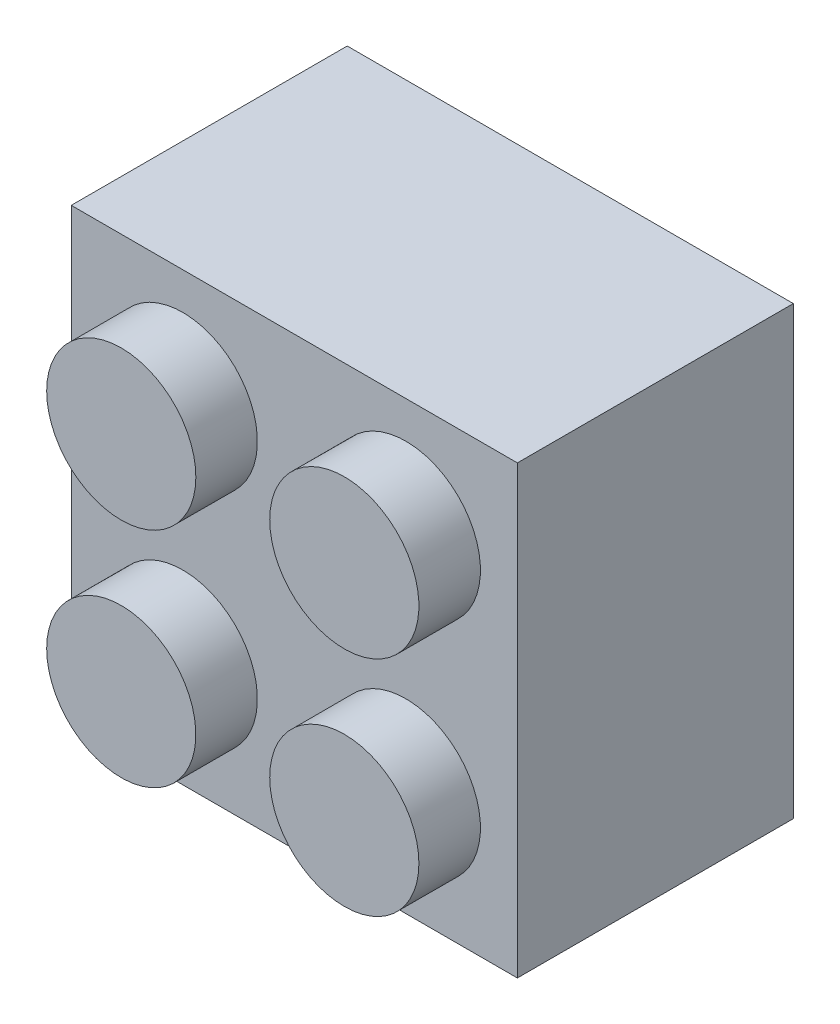
ISO-10303-21;
HEADER;
FILE_DESCRIPTION(('STEP AP214'),'2;1');
FILE_NAME('part.step','',(''),(''),'','','');
FILE_SCHEMA(('AUTOMOTIVE_DESIGN { 1 0 10303 214 1 1 1 1 }'));
ENDSEC;
DATA;
#1=APPLICATION_CONTEXT('core data for automotive mechanical design processes');
#2=APPLICATION_PROTOCOL_DEFINITION('international standard','automotive_design',2000,#1);
#3=PRODUCT_CONTEXT('',#1,'mechanical');
#4=PRODUCT('Part','Part','',(#3));
#5=PRODUCT_RELATED_PRODUCT_CATEGORY('part','',(#4));
#6=PRODUCT_DEFINITION_FORMATION('','',#4);
#7=PRODUCT_DEFINITION_CONTEXT('part definition',#1,'design');
#8=PRODUCT_DEFINITION('design','',#6,#7);
#9=PRODUCT_DEFINITION_SHAPE('','',#8);
#10=(LENGTH_UNIT() NAMED_UNIT(*) SI_UNIT(.MILLI.,.METRE.));
#11=(NAMED_UNIT(*) PLANE_ANGLE_UNIT() SI_UNIT($,.RADIAN.));
#12=(NAMED_UNIT(*) SI_UNIT($,.STERADIAN.) SOLID_ANGLE_UNIT());
#13=UNCERTAINTY_MEASURE_WITH_UNIT(LENGTH_MEASURE(1.E-05),#10,'distance_accuracy_value','');
#14=(GEOMETRIC_REPRESENTATION_CONTEXT(3) GLOBAL_UNCERTAINTY_ASSIGNED_CONTEXT((#13)) GLOBAL_UNIT_ASSIGNED_CONTEXT((#10,
#11,#12)) REPRESENTATION_CONTEXT('',''));
#15=CARTESIAN_POINT('',(0.,0.,0.));
#16=DIRECTION('',(0.,0.,1.));
#17=DIRECTION('',(1.,0.,0.));
#18=AXIS2_PLACEMENT_3D('',#15,#16,#17);
#19=CARTESIAN_POINT('',(0.,0.,0.));
#20=DIRECTION('',(0.,0.,-1.));
#21=DIRECTION('',(-1.,0.,0.));
#22=AXIS2_PLACEMENT_3D('',#19,#20,#21);
#23=PLANE('',#22);
#24=DIRECTION('',(-1.,0.,0.));
#25=VECTOR('',#24,1.);
#26=CARTESIAN_POINT('',(0.,95.7,0.));
#27=LINE('',#26,#25);
#28=CARTESIAN_POINT('',(95.7,95.7,0.));
#29=VERTEX_POINT('',#28);
#30=CARTESIAN_POINT('',(0.,95.7,0.));
#31=VERTEX_POINT('',#30);
#32=EDGE_CURVE('E189',#29,#31,#27,.T.);
#33=ORIENTED_EDGE('',*,*,#32,.F.);
#34=DIRECTION('',(0.,1.,0.));
#35=VECTOR('',#34,1.);
#36=CARTESIAN_POINT('',(95.7,95.7,0.));
#37=LINE('',#36,#35);
#38=CARTESIAN_POINT('',(95.7,0.,0.));
#39=VERTEX_POINT('',#38);
#40=EDGE_CURVE('E95',#39,#29,#37,.T.);
#41=ORIENTED_EDGE('',*,*,#40,.F.);
#42=DIRECTION('',(1.,0.,0.));
#43=VECTOR('',#42,1.);
#44=CARTESIAN_POINT('',(95.7,0.,0.));
#45=LINE('',#44,#43);
#46=CARTESIAN_POINT('',(0.,0.,0.));
#47=VERTEX_POINT('',#46);
#48=EDGE_CURVE('E201',#47,#39,#45,.T.);
#49=ORIENTED_EDGE('',*,*,#48,.F.);
#50=DIRECTION('',(0.,-1.,0.));
#51=VECTOR('',#50,1.);
#52=CARTESIAN_POINT('',(0.,95.7,0.));
#53=LINE('',#52,#51);
#54=EDGE_CURVE('E199',#31,#47,#53,.T.);
#55=ORIENTED_EDGE('',*,*,#54,.F.);
#56=EDGE_LOOP('',(#33,#41,#49,#55));
#57=FACE_BOUND('',#56,.T.);
#58=DIRECTION('',(1.,0.,0.));
#59=VECTOR('',#58,1.);
#60=CARTESIAN_POINT('',(0.,8.6,0.));
#61=LINE('',#60,#59);
#62=CARTESIAN_POINT('',(8.6,8.6,0.));
#63=VERTEX_POINT('',#62);
#64=CARTESIAN_POINT('',(87.1,8.6,0.));
#65=VERTEX_POINT('',#64);
#66=EDGE_CURVE('E159',#63,#65,#61,.T.);
#67=ORIENTED_EDGE('',*,*,#66,.T.);
#68=DIRECTION('',(0.,1.,0.));
#69=VECTOR('',#68,1.);
#70=CARTESIAN_POINT('',(87.1,0.,0.));
#71=LINE('',#70,#69);
#72=CARTESIAN_POINT('',(87.1,87.1,0.));
#73=VERTEX_POINT('',#72);
#74=EDGE_CURVE('E65',#65,#73,#71,.T.);
#75=ORIENTED_EDGE('',*,*,#74,.T.);
#76=DIRECTION('',(-1.,0.,0.));
#77=VECTOR('',#76,1.);
#78=CARTESIAN_POINT('',(0.,87.1,0.));
#79=LINE('',#78,#77);
#80=CARTESIAN_POINT('',(8.6,87.1,0.));
#81=VERTEX_POINT('',#80);
#82=EDGE_CURVE('E148',#73,#81,#79,.T.);
#83=ORIENTED_EDGE('',*,*,#82,.T.);
#84=DIRECTION('',(0.,-1.,0.));
#85=VECTOR('',#84,1.);
#86=CARTESIAN_POINT('',(8.6,0.,0.));
#87=LINE('',#86,#85);
#88=EDGE_CURVE('E161',#81,#63,#87,.T.);
#89=ORIENTED_EDGE('',*,*,#88,.T.);
#90=EDGE_LOOP('',(#67,#75,#83,#89));
#91=FACE_BOUND('',#90,.T.);
#92=ADVANCED_FACE('F50',(#57,#91),#23,.T.);
#93=CARTESIAN_POINT('',(0.,95.7,59.2));
#94=DIRECTION('',(0.,-1.,0.));
#95=DIRECTION('',(1.,0.,0.));
#96=AXIS2_PLACEMENT_3D('',#93,#94,#95);
#97=PLANE('',#96);
#98=ORIENTED_EDGE('',*,*,#32,.T.);
#99=DIRECTION('',(0.,0.,-1.));
#100=VECTOR('',#99,1.);
#101=CARTESIAN_POINT('',(0.,95.7,59.2));
#102=LINE('',#101,#100);
#103=CARTESIAN_POINT('',(0.,95.7,59.2));
#104=VERTEX_POINT('',#103);
#105=EDGE_CURVE('E210',#104,#31,#102,.T.);
#106=ORIENTED_EDGE('',*,*,#105,.F.);
#107=DIRECTION('',(-1.,0.,0.));
#108=VECTOR('',#107,1.);
#109=CARTESIAN_POINT('',(0.,95.7,59.2));
#110=LINE('',#109,#108);
#111=CARTESIAN_POINT('',(95.7,95.7,59.2));
#112=VERTEX_POINT('',#111);
#113=EDGE_CURVE('E190',#112,#104,#110,.T.);
#114=ORIENTED_EDGE('',*,*,#113,.F.);
#115=DIRECTION('',(0.,0.,-1.));
#116=VECTOR('',#115,1.);
#117=CARTESIAN_POINT('',(95.7,95.7,59.2));
#118=LINE('',#117,#116);
#119=EDGE_CURVE('E196',#112,#29,#118,.T.);
#120=ORIENTED_EDGE('',*,*,#119,.T.);
#121=EDGE_LOOP('',(#98,#106,#114,#120));
#122=FACE_BOUND('',#121,.T.);
#123=ADVANCED_FACE('F52',(#122),#97,.F.);
#124=CARTESIAN_POINT('',(0.,95.7,59.2));
#125=DIRECTION('',(1.,0.,0.));
#126=DIRECTION('',(0.,1.,0.));
#127=AXIS2_PLACEMENT_3D('',#124,#125,#126);
#128=PLANE('',#127);
#129=ORIENTED_EDGE('',*,*,#54,.T.);
#130=DIRECTION('',(0.,0.,-1.));
#131=VECTOR('',#130,1.);
#132=CARTESIAN_POINT('',(0.,0.,59.2));
#133=LINE('',#132,#131);
#134=CARTESIAN_POINT('',(0.,0.,59.2));
#135=VERTEX_POINT('',#134);
#136=EDGE_CURVE('E207',#135,#47,#133,.T.);
#137=ORIENTED_EDGE('',*,*,#136,.F.);
#138=DIRECTION('',(0.,-1.,0.));
#139=VECTOR('',#138,1.);
#140=CARTESIAN_POINT('',(0.,95.7,59.2));
#141=LINE('',#140,#139);
#142=EDGE_CURVE('E103',#104,#135,#141,.T.);
#143=ORIENTED_EDGE('',*,*,#142,.F.);
#144=ORIENTED_EDGE('',*,*,#105,.T.);
#145=EDGE_LOOP('',(#129,#137,#143,#144));
#146=FACE_BOUND('',#145,.T.);
#147=ADVANCED_FACE('F225',(#146),#128,.F.);
#148=CARTESIAN_POINT('',(95.7,0.,59.2));
#149=DIRECTION('',(0.,1.,0.));
#150=DIRECTION('',(0.,0.,1.));
#151=AXIS2_PLACEMENT_3D('',#148,#149,#150);
#152=PLANE('',#151);
#153=ORIENTED_EDGE('',*,*,#48,.T.);
#154=DIRECTION('',(0.,0.,-1.));
#155=VECTOR('',#154,1.);
#156=CARTESIAN_POINT('',(95.7,0.,59.2));
#157=LINE('',#156,#155);
#158=CARTESIAN_POINT('',(95.7,0.,59.2));
#159=VERTEX_POINT('',#158);
#160=EDGE_CURVE('E205',#159,#39,#157,.T.);
#161=ORIENTED_EDGE('',*,*,#160,.F.);
#162=DIRECTION('',(1.,0.,0.));
#163=VECTOR('',#162,1.);
#164=CARTESIAN_POINT('',(95.7,0.,59.2));
#165=LINE('',#164,#163);
#166=EDGE_CURVE('E193',#135,#159,#165,.T.);
#167=ORIENTED_EDGE('',*,*,#166,.F.);
#168=ORIENTED_EDGE('',*,*,#136,.T.);
#169=EDGE_LOOP('',(#153,#161,#167,#168));
#170=FACE_BOUND('',#169,.T.);
#171=ADVANCED_FACE('F230',(#170),#152,.F.);
#172=CARTESIAN_POINT('',(95.7,95.7,59.2));
#173=DIRECTION('',(-1.,0.,0.));
#174=DIRECTION('',(0.,-1.,0.));
#175=AXIS2_PLACEMENT_3D('',#172,#173,#174);
#176=PLANE('',#175);
#177=ORIENTED_EDGE('',*,*,#40,.T.);
#178=ORIENTED_EDGE('',*,*,#119,.F.);
#179=DIRECTION('',(0.,1.,0.));
#180=VECTOR('',#179,1.);
#181=CARTESIAN_POINT('',(95.7,95.7,59.2));
#182=LINE('',#181,#180);
#183=EDGE_CURVE('E74',#159,#112,#182,.T.);
#184=ORIENTED_EDGE('',*,*,#183,.F.);
#185=ORIENTED_EDGE('',*,*,#160,.T.);
#186=EDGE_LOOP('',(#177,#178,#184,#185));
#187=FACE_BOUND('',#186,.T.);
#188=ADVANCED_FACE('F218',(#187),#176,.F.);
#189=CARTESIAN_POINT('',(0.,0.,59.2));
#190=DIRECTION('',(0.,0.,-1.));
#191=DIRECTION('',(-1.,0.,0.));
#192=AXIS2_PLACEMENT_3D('',#189,#190,#191);
#193=PLANE('',#192);
#194=CARTESIAN_POINT('',(23.925,23.925,59.2));
#195=DIRECTION('',(0.,0.,-1.));
#196=DIRECTION('',(-1.,0.,0.));
#197=AXIS2_PLACEMENT_3D('',#194,#195,#196);
#198=CIRCLE('',#197,16.);
#199=CARTESIAN_POINT('',(7.92500000000003,23.925,59.2));
#200=VERTEX_POINT('',#199);
#201=EDGE_CURVE('E172',#200,#200,#198,.T.);
#202=ORIENTED_EDGE('',*,*,#201,.T.);
#203=EDGE_LOOP('',(#202));
#204=FACE_BOUND('',#203,.T.);
#205=CARTESIAN_POINT('',(71.775,23.925,59.2));
#206=DIRECTION('',(0.,0.,-1.));
#207=DIRECTION('',(-1.,0.,0.));
#208=AXIS2_PLACEMENT_3D('',#205,#206,#207);
#209=CIRCLE('',#208,16.);
#210=CARTESIAN_POINT('',(55.775,23.925,59.2));
#211=VERTEX_POINT('',#210);
#212=EDGE_CURVE('E12',#211,#211,#209,.F.);
#213=ORIENTED_EDGE('',*,*,#212,.F.);
#214=EDGE_LOOP('',(#213));
#215=FACE_BOUND('',#214,.T.);
#216=CARTESIAN_POINT('',(71.775,71.775,59.2));
#217=DIRECTION('',(0.,0.,-1.));
#218=DIRECTION('',(-1.,0.,0.));
#219=AXIS2_PLACEMENT_3D('',#216,#217,#218);
#220=CIRCLE('',#219,16.);
#221=CARTESIAN_POINT('',(55.775,71.775,59.2));
#222=VERTEX_POINT('',#221);
#223=EDGE_CURVE('E181',#222,#222,#220,.T.);
#224=ORIENTED_EDGE('',*,*,#223,.T.);
#225=EDGE_LOOP('',(#224));
#226=FACE_BOUND('',#225,.T.);
#227=CARTESIAN_POINT('',(23.925,71.775,59.2));
#228=DIRECTION('',(0.,0.,-1.));
#229=DIRECTION('',(-1.,0.,0.));
#230=AXIS2_PLACEMENT_3D('',#227,#228,#229);
#231=CIRCLE('',#230,16.);
#232=CARTESIAN_POINT('',(7.92499999999998,71.775,59.2));
#233=VERTEX_POINT('',#232);
#234=EDGE_CURVE('E58',#233,#233,#231,.F.);
#235=ORIENTED_EDGE('',*,*,#234,.F.);
#236=EDGE_LOOP('',(#235));
#237=FACE_BOUND('',#236,.T.);
#238=ORIENTED_EDGE('',*,*,#113,.T.);
#239=ORIENTED_EDGE('',*,*,#142,.T.);
#240=ORIENTED_EDGE('',*,*,#166,.T.);
#241=ORIENTED_EDGE('',*,*,#183,.T.);
#242=EDGE_LOOP('',(#238,#239,#240,#241));
#243=FACE_BOUND('',#242,.T.);
#244=ADVANCED_FACE('F216',(#204,#215,#226,#237,#243),#193,.F.);
#245=CARTESIAN_POINT('',(23.925,71.775,72.4));
#246=DIRECTION('',(0.,0.,-1.));
#247=DIRECTION('',(-1.,0.,0.));
#248=AXIS2_PLACEMENT_3D('',#245,#246,#247);
#249=CYLINDRICAL_SURFACE('',#248,16.);
#250=CARTESIAN_POINT('',(23.925,71.775,72.4));
#251=DIRECTION('',(0.,0.,1.));
#252=DIRECTION('',(1.,0.,0.));
#253=AXIS2_PLACEMENT_3D('',#250,#251,#252);
#254=CIRCLE('',#253,16.);
#255=CARTESIAN_POINT('',(39.925,71.775,72.4));
#256=VERTEX_POINT('',#255);
#257=EDGE_CURVE('E184',#256,#256,#254,.T.);
#258=ORIENTED_EDGE('',*,*,#257,.F.);
#259=EDGE_LOOP('',(#258));
#260=FACE_BOUND('',#259,.T.);
#261=ORIENTED_EDGE('',*,*,#234,.T.);
#262=EDGE_LOOP('',(#261));
#263=FACE_BOUND('',#262,.T.);
#264=ADVANCED_FACE('F214',(#260,#263),#249,.T.);
#265=CARTESIAN_POINT('',(23.925,71.775,72.4));
#266=DIRECTION('',(0.,0.,1.));
#267=DIRECTION('',(1.,0.,0.));
#268=AXIS2_PLACEMENT_3D('',#265,#266,#267);
#269=PLANE('',#268);
#270=ORIENTED_EDGE('',*,*,#257,.T.);
#271=EDGE_LOOP('',(#270));
#272=FACE_BOUND('',#271,.T.);
#273=ADVANCED_FACE('F279',(#272),#269,.T.);
#274=CARTESIAN_POINT('',(71.775,71.775,72.4));
#275=DIRECTION('',(0.,0.,-1.));
#276=DIRECTION('',(-1.,0.,0.));
#277=AXIS2_PLACEMENT_3D('',#274,#275,#276);
#278=CYLINDRICAL_SURFACE('',#277,16.);
#279=CARTESIAN_POINT('',(71.775,71.775,72.4));
#280=DIRECTION('',(0.,0.,-1.));
#281=DIRECTION('',(-1.,0.,0.));
#282=AXIS2_PLACEMENT_3D('',#279,#280,#281);
#283=CIRCLE('',#282,16.);
#284=CARTESIAN_POINT('',(55.775,71.775,72.4));
#285=VERTEX_POINT('',#284);
#286=EDGE_CURVE('E180',#285,#285,#283,.T.);
#287=ORIENTED_EDGE('',*,*,#286,.T.);
#288=EDGE_LOOP('',(#287));
#289=FACE_BOUND('',#288,.T.);
#290=ORIENTED_EDGE('',*,*,#223,.F.);
#291=EDGE_LOOP('',(#290));
#292=FACE_BOUND('',#291,.T.);
#293=ADVANCED_FACE('F276',(#289,#292),#278,.T.);
#294=CARTESIAN_POINT('',(71.775,71.775,72.4));
#295=DIRECTION('',(0.,0.,-1.));
#296=DIRECTION('',(-1.,0.,0.));
#297=AXIS2_PLACEMENT_3D('',#294,#295,#296);
#298=PLANE('',#297);
#299=ORIENTED_EDGE('',*,*,#286,.F.);
#300=EDGE_LOOP('',(#299));
#301=FACE_BOUND('',#300,.T.);
#302=ADVANCED_FACE('F271',(#301),#298,.F.);
#303=CARTESIAN_POINT('',(71.775,23.925,72.4));
#304=DIRECTION('',(0.,0.,-1.));
#305=DIRECTION('',(-1.,0.,0.));
#306=AXIS2_PLACEMENT_3D('',#303,#304,#305);
#307=CYLINDRICAL_SURFACE('',#306,16.);
#308=CARTESIAN_POINT('',(71.775,23.925,72.4));
#309=DIRECTION('',(0.,0.,1.));
#310=DIRECTION('',(1.,0.,0.));
#311=AXIS2_PLACEMENT_3D('',#308,#309,#310);
#312=CIRCLE('',#311,16.);
#313=CARTESIAN_POINT('',(87.775,23.925,72.4));
#314=VERTEX_POINT('',#313);
#315=EDGE_CURVE('E175',#314,#314,#312,.T.);
#316=ORIENTED_EDGE('',*,*,#315,.F.);
#317=EDGE_LOOP('',(#316));
#318=FACE_BOUND('',#317,.T.);
#319=ORIENTED_EDGE('',*,*,#212,.T.);
#320=EDGE_LOOP('',(#319));
#321=FACE_BOUND('',#320,.T.);
#322=ADVANCED_FACE('F268',(#318,#321),#307,.T.);
#323=CARTESIAN_POINT('',(71.775,23.925,72.4));
#324=DIRECTION('',(0.,0.,1.));
#325=DIRECTION('',(1.,0.,0.));
#326=AXIS2_PLACEMENT_3D('',#323,#324,#325);
#327=PLANE('',#326);
#328=ORIENTED_EDGE('',*,*,#315,.T.);
#329=EDGE_LOOP('',(#328));
#330=FACE_BOUND('',#329,.T.);
#331=ADVANCED_FACE('F263',(#330),#327,.T.);
#332=CARTESIAN_POINT('',(23.925,23.925,72.4));
#333=DIRECTION('',(0.,0.,-1.));
#334=DIRECTION('',(-1.,0.,0.));
#335=AXIS2_PLACEMENT_3D('',#332,#333,#334);
#336=CYLINDRICAL_SURFACE('',#335,16.);
#337=CARTESIAN_POINT('',(23.925,23.925,72.4));
#338=DIRECTION('',(0.,0.,-1.));
#339=DIRECTION('',(-1.,0.,0.));
#340=AXIS2_PLACEMENT_3D('',#337,#338,#339);
#341=CIRCLE('',#340,16.);
#342=CARTESIAN_POINT('',(7.92500000000003,23.925,72.4));
#343=VERTEX_POINT('',#342);
#344=EDGE_CURVE('E168',#343,#343,#341,.T.);
#345=ORIENTED_EDGE('',*,*,#344,.T.);
#346=EDGE_LOOP('',(#345));
#347=FACE_BOUND('',#346,.T.);
#348=ORIENTED_EDGE('',*,*,#201,.F.);
#349=EDGE_LOOP('',(#348));
#350=FACE_BOUND('',#349,.T.);
#351=ADVANCED_FACE('F260',(#347,#350),#336,.T.);
#352=CARTESIAN_POINT('',(23.925,23.925,72.4));
#353=DIRECTION('',(0.,0.,-1.));
#354=DIRECTION('',(-1.,0.,0.));
#355=AXIS2_PLACEMENT_3D('',#352,#353,#354);
#356=PLANE('',#355);
#357=ORIENTED_EDGE('',*,*,#344,.F.);
#358=EDGE_LOOP('',(#357));
#359=FACE_BOUND('',#358,.T.);
#360=ADVANCED_FACE('F250',(#359),#356,.F.);
#361=CARTESIAN_POINT('',(87.1,0.,51.1));
#362=DIRECTION('',(-1.,0.,0.));
#363=DIRECTION('',(0.,0.,1.));
#364=AXIS2_PLACEMENT_3D('',#361,#362,#363);
#365=PLANE('',#364);
#366=ORIENTED_EDGE('',*,*,#74,.F.);
#367=DIRECTION('',(0.,0.,-1.));
#368=VECTOR('',#367,1.);
#369=CARTESIAN_POINT('',(87.1,8.6,51.1));
#370=LINE('',#369,#368);
#371=CARTESIAN_POINT('',(87.1,8.6,51.1));
#372=VERTEX_POINT('',#371);
#373=EDGE_CURVE('E130',#372,#65,#370,.T.);
#374=ORIENTED_EDGE('',*,*,#373,.F.);
#375=DIRECTION('',(0.,1.,0.));
#376=VECTOR('',#375,1.);
#377=CARTESIAN_POINT('',(87.1,0.,51.1));
#378=LINE('',#377,#376);
#379=CARTESIAN_POINT('',(87.1,87.1,51.1));
#380=VERTEX_POINT('',#379);
#381=EDGE_CURVE('E137',#372,#380,#378,.T.);
#382=ORIENTED_EDGE('',*,*,#381,.T.);
#383=DIRECTION('',(0.,0.,-1.));
#384=VECTOR('',#383,1.);
#385=CARTESIAN_POINT('',(87.1,87.1,51.1));
#386=LINE('',#385,#384);
#387=EDGE_CURVE('E166',#380,#73,#386,.T.);
#388=ORIENTED_EDGE('',*,*,#387,.T.);
#389=EDGE_LOOP('',(#366,#374,#382,#388));
#390=FACE_BOUND('',#389,.T.);
#391=ADVANCED_FACE('F140',(#390),#365,.T.);
#392=CARTESIAN_POINT('',(0.,87.1,51.1));
#393=DIRECTION('',(0.,-1.,0.));
#394=DIRECTION('',(0.,0.,-1.));
#395=AXIS2_PLACEMENT_3D('',#392,#393,#394);
#396=PLANE('',#395);
#397=ORIENTED_EDGE('',*,*,#82,.F.);
#398=ORIENTED_EDGE('',*,*,#387,.F.);
#399=DIRECTION('',(-1.,0.,0.));
#400=VECTOR('',#399,1.);
#401=CARTESIAN_POINT('',(0.,87.1,51.1));
#402=LINE('',#401,#400);
#403=CARTESIAN_POINT('',(8.6,87.1,51.1));
#404=VERTEX_POINT('',#403);
#405=EDGE_CURVE('E142',#380,#404,#402,.T.);
#406=ORIENTED_EDGE('',*,*,#405,.T.);
#407=DIRECTION('',(0.,0.,-1.));
#408=VECTOR('',#407,1.);
#409=CARTESIAN_POINT('',(8.6,87.1,51.1));
#410=LINE('',#409,#408);
#411=EDGE_CURVE('E169',#404,#81,#410,.T.);
#412=ORIENTED_EDGE('',*,*,#411,.T.);
#413=EDGE_LOOP('',(#397,#398,#406,#412));
#414=FACE_BOUND('',#413,.T.);
#415=ADVANCED_FACE('F241',(#414),#396,.T.);
#416=CARTESIAN_POINT('',(8.6,0.,51.1));
#417=DIRECTION('',(1.,0.,0.));
#418=DIRECTION('',(0.,0.,-1.));
#419=AXIS2_PLACEMENT_3D('',#416,#417,#418);
#420=PLANE('',#419);
#421=ORIENTED_EDGE('',*,*,#88,.F.);
#422=ORIENTED_EDGE('',*,*,#411,.F.);
#423=DIRECTION('',(0.,-1.,0.));
#424=VECTOR('',#423,1.);
#425=CARTESIAN_POINT('',(8.6,0.,51.1));
#426=LINE('',#425,#424);
#427=CARTESIAN_POINT('',(8.6,8.6,51.1));
#428=VERTEX_POINT('',#427);
#429=EDGE_CURVE('E136',#404,#428,#426,.T.);
#430=ORIENTED_EDGE('',*,*,#429,.T.);
#431=DIRECTION('',(0.,0.,-1.));
#432=VECTOR('',#431,1.);
#433=CARTESIAN_POINT('',(8.6,8.6,51.1));
#434=LINE('',#433,#432);
#435=EDGE_CURVE('E132',#428,#63,#434,.T.);
#436=ORIENTED_EDGE('',*,*,#435,.T.);
#437=EDGE_LOOP('',(#421,#422,#430,#436));
#438=FACE_BOUND('',#437,.T.);
#439=ADVANCED_FACE('F239',(#438),#420,.T.);
#440=CARTESIAN_POINT('',(47.85,47.85,51.1));
#441=DIRECTION('',(0.,0.,-1.));
#442=DIRECTION('',(-1.,0.,0.));
#443=AXIS2_PLACEMENT_3D('',#440,#441,#442);
#444=CYLINDRICAL_SURFACE('',#443,17.15);
#445=CARTESIAN_POINT('',(47.85,47.85,51.1));
#446=DIRECTION('',(0.,0.,-1.));
#447=DIRECTION('',(-1.,0.,0.));
#448=AXIS2_PLACEMENT_3D('',#445,#446,#447);
#449=CIRCLE('',#448,17.15);
#450=CARTESIAN_POINT('',(30.7,47.85,51.1));
#451=VERTEX_POINT('',#450);
#452=EDGE_CURVE('E145',#451,#451,#449,.T.);
#453=ORIENTED_EDGE('',*,*,#452,.T.);
#454=EDGE_LOOP('',(#453));
#455=FACE_BOUND('',#454,.T.);
#456=CARTESIAN_POINT('',(47.85,47.85,0.));
#457=DIRECTION('',(0.,0.,-1.));
#458=DIRECTION('',(-1.,0.,0.));
#459=AXIS2_PLACEMENT_3D('',#456,#457,#458);
#460=CIRCLE('',#459,17.15);
#461=CARTESIAN_POINT('',(30.7,47.85,0.));
#462=VERTEX_POINT('',#461);
#463=EDGE_CURVE('E154',#462,#462,#460,.T.);
#464=ORIENTED_EDGE('',*,*,#463,.F.);
#465=EDGE_LOOP('',(#464));
#466=FACE_BOUND('',#465,.T.);
#467=ADVANCED_FACE('F248',(#455,#466),#444,.T.);
#468=CARTESIAN_POINT('',(0.,8.6,51.1));
#469=DIRECTION('',(0.,1.,0.));
#470=DIRECTION('',(0.,0.,1.));
#471=AXIS2_PLACEMENT_3D('',#468,#469,#470);
#472=PLANE('',#471);
#473=ORIENTED_EDGE('',*,*,#66,.F.);
#474=ORIENTED_EDGE('',*,*,#435,.F.);
#475=DIRECTION('',(1.,0.,0.));
#476=VECTOR('',#475,1.);
#477=CARTESIAN_POINT('',(0.,8.6,51.1));
#478=LINE('',#477,#476);
#479=EDGE_CURVE('E127',#428,#372,#478,.T.);
#480=ORIENTED_EDGE('',*,*,#479,.T.);
#481=ORIENTED_EDGE('',*,*,#373,.T.);
#482=EDGE_LOOP('',(#473,#474,#480,#481));
#483=FACE_BOUND('',#482,.T.);
#484=ADVANCED_FACE('F129',(#483),#472,.T.);
#485=CARTESIAN_POINT('',(0.,0.,51.1));
#486=DIRECTION('',(0.,0.,-1.));
#487=DIRECTION('',(-1.,0.,0.));
#488=AXIS2_PLACEMENT_3D('',#485,#486,#487);
#489=PLANE('',#488);
#490=ORIENTED_EDGE('',*,*,#452,.F.);
#491=EDGE_LOOP('',(#490));
#492=FACE_BOUND('',#491,.T.);
#493=ORIENTED_EDGE('',*,*,#381,.F.);
#494=ORIENTED_EDGE('',*,*,#479,.F.);
#495=ORIENTED_EDGE('',*,*,#429,.F.);
#496=ORIENTED_EDGE('',*,*,#405,.F.);
#497=EDGE_LOOP('',(#493,#494,#495,#496));
#498=FACE_BOUND('',#497,.T.);
#499=ADVANCED_FACE('F144',(#492,#498),#489,.T.);
#500=CARTESIAN_POINT('',(47.85,47.85,0.));
#501=DIRECTION('',(0.,0.,-1.));
#502=DIRECTION('',(-1.,0.,0.));
#503=AXIS2_PLACEMENT_3D('',#500,#501,#502);
#504=CIRCLE('',#503,9.75000000000002);
#505=CARTESIAN_POINT('',(38.1,47.85,0.));
#506=VERTEX_POINT('',#505);
#507=EDGE_CURVE('E376',#506,#506,#504,.T.);
#508=ORIENTED_EDGE('',*,*,#507,.F.);
#509=EDGE_LOOP('',(#508));
#510=FACE_BOUND('',#509,.T.);
#511=ORIENTED_EDGE('',*,*,#463,.T.);
#512=EDGE_LOOP('',(#511));
#513=FACE_BOUND('',#512,.T.);
#514=ADVANCED_FACE('F235',(#510,#513),#23,.T.);
#515=CARTESIAN_POINT('',(47.85,47.85,51.1));
#516=DIRECTION('',(0.,0.,-1.));
#517=DIRECTION('',(-1.,0.,0.));
#518=AXIS2_PLACEMENT_3D('',#515,#516,#517);
#519=CYLINDRICAL_SURFACE('',#518,9.75000000000002);
#520=CARTESIAN_POINT('',(47.85,47.85,51.1));
#521=DIRECTION('',(0.,0.,-1.));
#522=DIRECTION('',(-1.,0.,0.));
#523=AXIS2_PLACEMENT_3D('',#520,#521,#522);
#524=CIRCLE('',#523,9.75000000000002);
#525=CARTESIAN_POINT('',(38.1,47.85,51.1));
#526=VERTEX_POINT('',#525);
#527=EDGE_CURVE('E157',#526,#526,#524,.T.);
#528=ORIENTED_EDGE('',*,*,#527,.F.);
#529=EDGE_LOOP('',(#528));
#530=FACE_BOUND('',#529,.T.);
#531=ORIENTED_EDGE('',*,*,#507,.T.);
#532=EDGE_LOOP('',(#531));
#533=FACE_BOUND('',#532,.T.);
#534=ADVANCED_FACE('F291',(#530,#533),#519,.F.);
#535=CARTESIAN_POINT('',(0.,0.,51.1));
#536=DIRECTION('',(0.,0.,-1.));
#537=DIRECTION('',(-1.,0.,0.));
#538=AXIS2_PLACEMENT_3D('',#535,#536,#537);
#539=PLANE('',#538);
#540=ORIENTED_EDGE('',*,*,#527,.T.);
#541=EDGE_LOOP('',(#540));
#542=FACE_BOUND('',#541,.T.);
#543=ADVANCED_FACE('F361',(#542),#539,.T.);
#544=CLOSED_SHELL('',(#92,#123,#147,#171,#188,#244,#264,#273,#293,#302,#322,#331,#351,#360,#391,
#415,#439,#467,#484,#499,#514,#534,#543));
#545=MANIFOLD_SOLID_BREP('B2',#544);
#546=ADVANCED_BREP_SHAPE_REPRESENTATION('',(#18,#545),#14);
#547=SHAPE_DEFINITION_REPRESENTATION(#9,#546);
ENDSEC;
END-ISO-10303-21;
